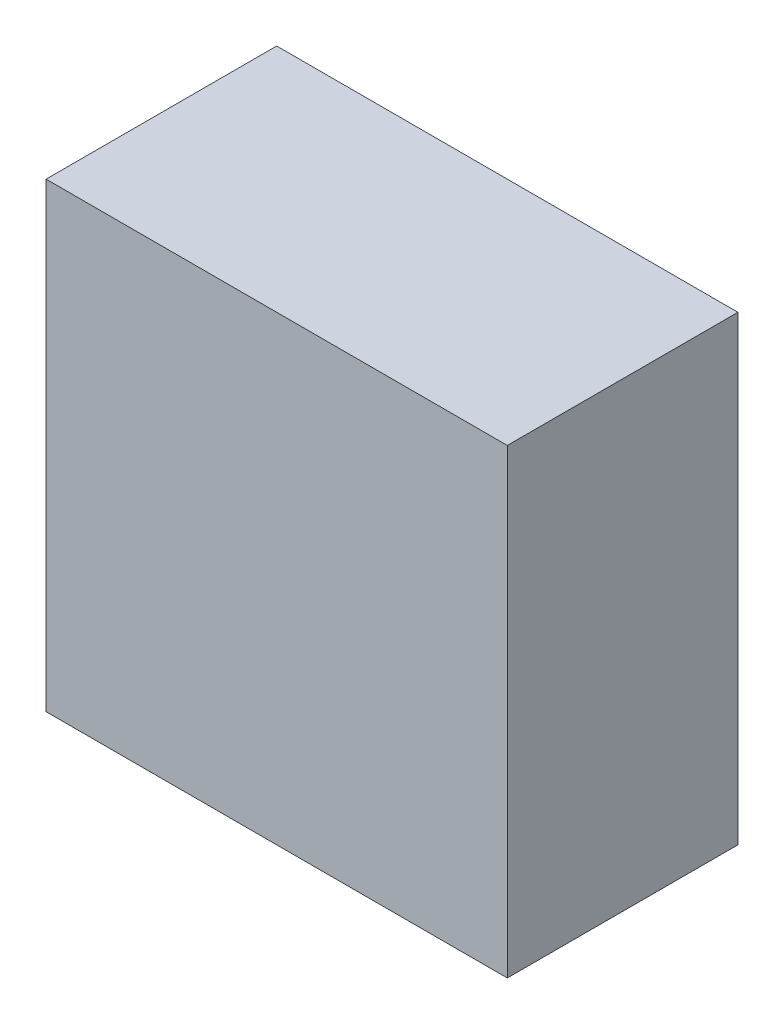
ISO-10303-21;
HEADER;
FILE_DESCRIPTION(('STEP AP214'),'2;1');
FILE_NAME('part.step','',(''),(''),'','','');
FILE_SCHEMA(('AUTOMOTIVE_DESIGN { 1 0 10303 214 1 1 1 1 }'));
ENDSEC;
DATA;
#1=APPLICATION_CONTEXT('core data for automotive mechanical design processes');
#2=APPLICATION_PROTOCOL_DEFINITION('international standard','automotive_design',2000,#1);
#3=PRODUCT_CONTEXT('',#1,'mechanical');
#4=PRODUCT('Part','Part','',(#3));
#5=PRODUCT_RELATED_PRODUCT_CATEGORY('part','',(#4));
#6=PRODUCT_DEFINITION_FORMATION('','',#4);
#7=PRODUCT_DEFINITION_CONTEXT('part definition',#1,'design');
#8=PRODUCT_DEFINITION('design','',#6,#7);
#9=PRODUCT_DEFINITION_SHAPE('','',#8);
#10=(LENGTH_UNIT() NAMED_UNIT(*) SI_UNIT(.MILLI.,.METRE.));
#11=(NAMED_UNIT(*) PLANE_ANGLE_UNIT() SI_UNIT($,.RADIAN.));
#12=(NAMED_UNIT(*) SI_UNIT($,.STERADIAN.) SOLID_ANGLE_UNIT());
#13=UNCERTAINTY_MEASURE_WITH_UNIT(LENGTH_MEASURE(1.E-05),#10,'distance_accuracy_value','');
#14=(GEOMETRIC_REPRESENTATION_CONTEXT(3) GLOBAL_UNCERTAINTY_ASSIGNED_CONTEXT((#13)) GLOBAL_UNIT_ASSIGNED_CONTEXT((#10,
#11,#12)) REPRESENTATION_CONTEXT('',''));
#15=CARTESIAN_POINT('',(0.,0.,0.));
#16=DIRECTION('',(0.,0.,1.));
#17=DIRECTION('',(1.,0.,0.));
#18=AXIS2_PLACEMENT_3D('',#15,#16,#17);
#19=CARTESIAN_POINT('',(0.,0.,35.));
#20=DIRECTION('',(1.,0.,0.));
#21=DIRECTION('',(0.,0.,-1.));
#22=AXIS2_PLACEMENT_3D('',#19,#20,#21);
#23=PLANE('',#22);
#24=DIRECTION('',(0.,-1.,0.));
#25=VECTOR('',#24,1.);
#26=CARTESIAN_POINT('',(0.,0.,0.));
#27=LINE('',#26,#25);
#28=CARTESIAN_POINT('',(0.,70.,0.));
#29=VERTEX_POINT('',#28);
#30=CARTESIAN_POINT('',(0.,0.,0.));
#31=VERTEX_POINT('',#30);
#32=EDGE_CURVE('E97',#29,#31,#27,.T.);
#33=ORIENTED_EDGE('',*,*,#32,.T.);
#34=DIRECTION('',(0.,0.,-1.));
#35=VECTOR('',#34,1.);
#36=CARTESIAN_POINT('',(0.,0.,35.));
#37=LINE('',#36,#35);
#38=CARTESIAN_POINT('',(0.,0.,35.));
#39=VERTEX_POINT('',#38);
#40=EDGE_CURVE('E11',#39,#31,#37,.T.);
#41=ORIENTED_EDGE('',*,*,#40,.F.);
#42=DIRECTION('',(0.,-1.,0.));
#43=VECTOR('',#42,1.);
#44=CARTESIAN_POINT('',(0.,0.,35.));
#45=LINE('',#44,#43);
#46=CARTESIAN_POINT('',(0.,70.,35.));
#47=VERTEX_POINT('',#46);
#48=EDGE_CURVE('E85',#47,#39,#45,.T.);
#49=ORIENTED_EDGE('',*,*,#48,.F.);
#50=DIRECTION('',(0.,0.,-1.));
#51=VECTOR('',#50,1.);
#52=CARTESIAN_POINT('',(0.,70.,35.));
#53=LINE('',#52,#51);
#54=EDGE_CURVE('E93',#47,#29,#53,.T.);
#55=ORIENTED_EDGE('',*,*,#54,.T.);
#56=EDGE_LOOP('',(#33,#41,#49,#55));
#57=FACE_BOUND('',#56,.T.);
#58=ADVANCED_FACE('F34',(#57),#23,.F.);
#59=CARTESIAN_POINT('',(0.,0.,35.));
#60=DIRECTION('',(0.,1.,0.));
#61=DIRECTION('',(0.,0.,1.));
#62=AXIS2_PLACEMENT_3D('',#59,#60,#61);
#63=PLANE('',#62);
#64=DIRECTION('',(1.,0.,0.));
#65=VECTOR('',#64,1.);
#66=CARTESIAN_POINT('',(0.,0.,0.));
#67=LINE('',#66,#65);
#68=CARTESIAN_POINT('',(70.,0.,0.));
#69=VERTEX_POINT('',#68);
#70=EDGE_CURVE('E89',#31,#69,#67,.T.);
#71=ORIENTED_EDGE('',*,*,#70,.T.);
#72=DIRECTION('',(0.,0.,-1.));
#73=VECTOR('',#72,1.);
#74=CARTESIAN_POINT('',(70.,0.,35.));
#75=LINE('',#74,#73);
#76=CARTESIAN_POINT('',(70.,0.,35.));
#77=VERTEX_POINT('',#76);
#78=EDGE_CURVE('E42',#77,#69,#75,.T.);
#79=ORIENTED_EDGE('',*,*,#78,.F.);
#80=DIRECTION('',(1.,0.,0.));
#81=VECTOR('',#80,1.);
#82=CARTESIAN_POINT('',(0.,0.,35.));
#83=LINE('',#82,#81);
#84=EDGE_CURVE('E80',#39,#77,#83,.T.);
#85=ORIENTED_EDGE('',*,*,#84,.F.);
#86=ORIENTED_EDGE('',*,*,#40,.T.);
#87=EDGE_LOOP('',(#71,#79,#85,#86));
#88=FACE_BOUND('',#87,.T.);
#89=ADVANCED_FACE('F88',(#88),#63,.F.);
#90=CARTESIAN_POINT('',(70.,0.,35.));
#91=DIRECTION('',(-1.,0.,0.));
#92=DIRECTION('',(0.,0.,1.));
#93=AXIS2_PLACEMENT_3D('',#90,#91,#92);
#94=PLANE('',#93);
#95=DIRECTION('',(0.,1.,0.));
#96=VECTOR('',#95,1.);
#97=CARTESIAN_POINT('',(70.,0.,0.));
#98=LINE('',#97,#96);
#99=CARTESIAN_POINT('',(70.,70.,0.));
#100=VERTEX_POINT('',#99);
#101=EDGE_CURVE('E67',#69,#100,#98,.T.);
#102=ORIENTED_EDGE('',*,*,#101,.T.);
#103=DIRECTION('',(0.,0.,-1.));
#104=VECTOR('',#103,1.);
#105=CARTESIAN_POINT('',(70.,70.,35.));
#106=LINE('',#105,#104);
#107=CARTESIAN_POINT('',(70.,70.,35.));
#108=VERTEX_POINT('',#107);
#109=EDGE_CURVE('E90',#108,#100,#106,.T.);
#110=ORIENTED_EDGE('',*,*,#109,.F.);
#111=DIRECTION('',(0.,1.,0.));
#112=VECTOR('',#111,1.);
#113=CARTESIAN_POINT('',(70.,0.,35.));
#114=LINE('',#113,#112);
#115=EDGE_CURVE('E83',#77,#108,#114,.T.);
#116=ORIENTED_EDGE('',*,*,#115,.F.);
#117=ORIENTED_EDGE('',*,*,#78,.T.);
#118=EDGE_LOOP('',(#102,#110,#116,#117));
#119=FACE_BOUND('',#118,.T.);
#120=ADVANCED_FACE('F91',(#119),#94,.F.);
#121=CARTESIAN_POINT('',(0.,70.,35.));
#122=DIRECTION('',(0.,-1.,0.));
#123=DIRECTION('',(0.,0.,-1.));
#124=AXIS2_PLACEMENT_3D('',#121,#122,#123);
#125=PLANE('',#124);
#126=DIRECTION('',(-1.,0.,0.));
#127=VECTOR('',#126,1.);
#128=CARTESIAN_POINT('',(0.,70.,0.));
#129=LINE('',#128,#127);
#130=EDGE_CURVE('E73',#100,#29,#129,.T.);
#131=ORIENTED_EDGE('',*,*,#130,.T.);
#132=ORIENTED_EDGE('',*,*,#54,.F.);
#133=DIRECTION('',(-1.,0.,0.));
#134=VECTOR('',#133,1.);
#135=CARTESIAN_POINT('',(0.,70.,35.));
#136=LINE('',#135,#134);
#137=EDGE_CURVE('E50',#108,#47,#136,.T.);
#138=ORIENTED_EDGE('',*,*,#137,.F.);
#139=ORIENTED_EDGE('',*,*,#109,.T.);
#140=EDGE_LOOP('',(#131,#132,#138,#139));
#141=FACE_BOUND('',#140,.T.);
#142=ADVANCED_FACE('F104',(#141),#125,.F.);
#143=CARTESIAN_POINT('',(0.,0.,35.));
#144=DIRECTION('',(0.,0.,-1.));
#145=DIRECTION('',(-1.,0.,0.));
#146=AXIS2_PLACEMENT_3D('',#143,#144,#145);
#147=PLANE('',#146);
#148=ORIENTED_EDGE('',*,*,#48,.T.);
#149=ORIENTED_EDGE('',*,*,#84,.T.);
#150=ORIENTED_EDGE('',*,*,#115,.T.);
#151=ORIENTED_EDGE('',*,*,#137,.T.);
#152=EDGE_LOOP('',(#148,#149,#150,#151));
#153=FACE_BOUND('',#152,.T.);
#154=ADVANCED_FACE('F81',(#153),#147,.F.);
#155=CARTESIAN_POINT('',(0.,0.,0.));
#156=DIRECTION('',(0.,0.,-1.));
#157=DIRECTION('',(-1.,0.,0.));
#158=AXIS2_PLACEMENT_3D('',#155,#156,#157);
#159=PLANE('',#158);
#160=ORIENTED_EDGE('',*,*,#32,.F.);
#161=ORIENTED_EDGE('',*,*,#130,.F.);
#162=ORIENTED_EDGE('',*,*,#101,.F.);
#163=ORIENTED_EDGE('',*,*,#70,.F.);
#164=EDGE_LOOP('',(#160,#161,#162,#163));
#165=FACE_BOUND('',#164,.T.);
#166=ADVANCED_FACE('F107',(#165),#159,.T.);
#167=CLOSED_SHELL('',(#58,#89,#120,#142,#154,#166));
#168=MANIFOLD_SOLID_BREP('B2',#167);
#169=ADVANCED_BREP_SHAPE_REPRESENTATION('',(#18,#168),#14);
#170=SHAPE_DEFINITION_REPRESENTATION(#9,#169);
ENDSEC;
END-ISO-10303-21;
